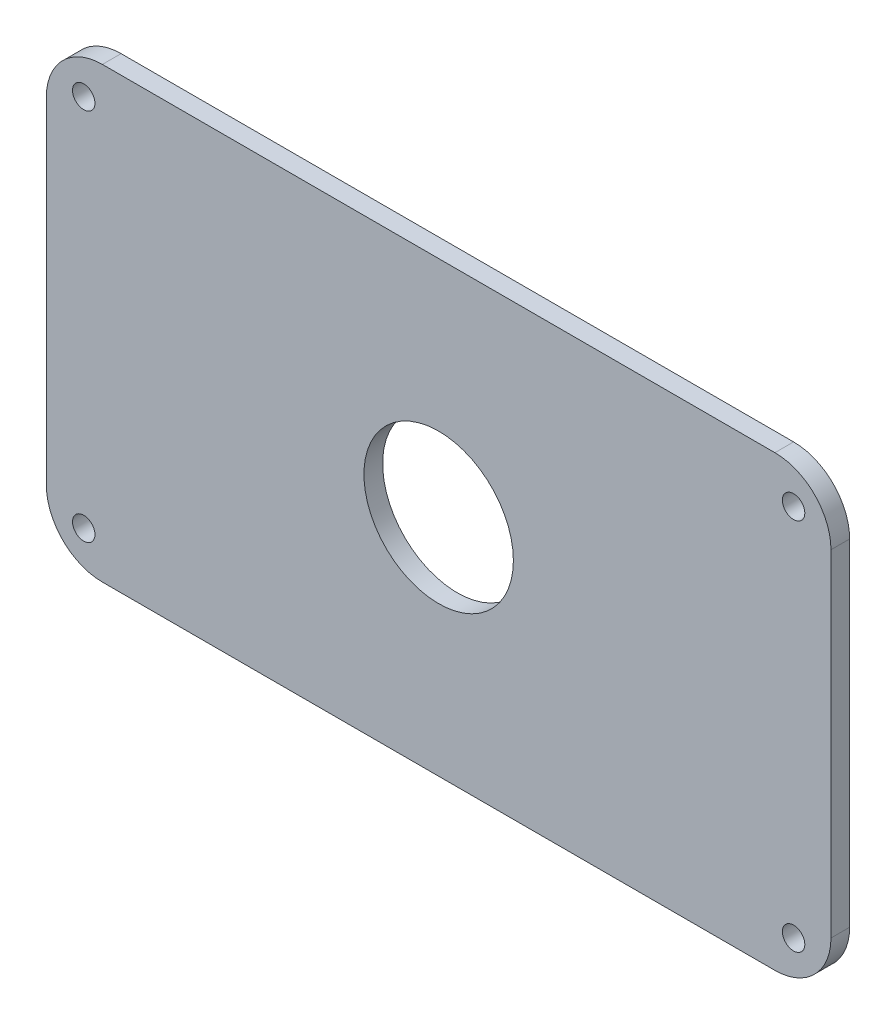
ISO-10303-21;
HEADER;
FILE_DESCRIPTION(('STEP AP214'),'2;1');
FILE_NAME('part.step','',(''),(''),'','','');
FILE_SCHEMA(('AUTOMOTIVE_DESIGN { 1 0 10303 214 1 1 1 1 }'));
ENDSEC;
DATA;
#1=APPLICATION_CONTEXT('core data for automotive mechanical design processes');
#2=APPLICATION_PROTOCOL_DEFINITION('international standard','automotive_design',2000,#1);
#3=PRODUCT_CONTEXT('',#1,'mechanical');
#4=PRODUCT('Part','Part','',(#3));
#5=PRODUCT_RELATED_PRODUCT_CATEGORY('part','',(#4));
#6=PRODUCT_DEFINITION_FORMATION('','',#4);
#7=PRODUCT_DEFINITION_CONTEXT('part definition',#1,'design');
#8=PRODUCT_DEFINITION('design','',#6,#7);
#9=PRODUCT_DEFINITION_SHAPE('','',#8);
#10=(LENGTH_UNIT() NAMED_UNIT(*) SI_UNIT(.MILLI.,.METRE.));
#11=(NAMED_UNIT(*) PLANE_ANGLE_UNIT() SI_UNIT($,.RADIAN.));
#12=(NAMED_UNIT(*) SI_UNIT($,.STERADIAN.) SOLID_ANGLE_UNIT());
#13=UNCERTAINTY_MEASURE_WITH_UNIT(LENGTH_MEASURE(1.E-05),#10,'distance_accuracy_value','');
#14=(GEOMETRIC_REPRESENTATION_CONTEXT(3) GLOBAL_UNCERTAINTY_ASSIGNED_CONTEXT((#13)) GLOBAL_UNIT_ASSIGNED_CONTEXT((#10,
#11,#12)) REPRESENTATION_CONTEXT('',''));
#15=CARTESIAN_POINT('',(0.,0.,0.));
#16=DIRECTION('',(0.,0.,1.));
#17=DIRECTION('',(1.,0.,0.));
#18=AXIS2_PLACEMENT_3D('',#15,#16,#17);
#19=CARTESIAN_POINT('',(15.,-45.,5.));
#20=DIRECTION('',(0.,0.,-1.));
#21=DIRECTION('',(-1.,0.,0.));
#22=AXIS2_PLACEMENT_3D('',#19,#20,#21);
#23=CYLINDRICAL_SURFACE('',#22,15.);
#24=CARTESIAN_POINT('',(15.,-45.,0.));
#25=DIRECTION('',(0.,0.,1.));
#26=DIRECTION('',(1.,0.,0.));
#27=AXIS2_PLACEMENT_3D('',#24,#25,#26);
#28=CIRCLE('',#27,15.);
#29=CARTESIAN_POINT('',(0.,-45.,0.));
#30=VERTEX_POINT('',#29);
#31=CARTESIAN_POINT('',(15.,-60.,0.));
#32=VERTEX_POINT('',#31);
#33=EDGE_CURVE('E133',#30,#32,#28,.T.);
#34=ORIENTED_EDGE('',*,*,#33,.T.);
#35=DIRECTION('',(0.,0.,-1.));
#36=VECTOR('',#35,1.);
#37=CARTESIAN_POINT('',(15.,-60.,5.));
#38=LINE('',#37,#36);
#39=CARTESIAN_POINT('',(15.,-60.,5.));
#40=VERTEX_POINT('',#39);
#41=EDGE_CURVE('E11',#40,#32,#38,.T.);
#42=ORIENTED_EDGE('',*,*,#41,.F.);
#43=CARTESIAN_POINT('',(15.,-45.,5.));
#44=DIRECTION('',(0.,0.,1.));
#45=DIRECTION('',(1.,0.,0.));
#46=AXIS2_PLACEMENT_3D('',#43,#44,#45);
#47=CIRCLE('',#46,15.);
#48=CARTESIAN_POINT('',(0.,-45.,5.));
#49=VERTEX_POINT('',#48);
#50=EDGE_CURVE('E148',#49,#40,#47,.T.);
#51=ORIENTED_EDGE('',*,*,#50,.F.);
#52=DIRECTION('',(0.,0.,-1.));
#53=VECTOR('',#52,1.);
#54=CARTESIAN_POINT('',(0.,-45.,5.));
#55=LINE('',#54,#53);
#56=EDGE_CURVE('E129',#49,#30,#55,.T.);
#57=ORIENTED_EDGE('',*,*,#56,.T.);
#58=EDGE_LOOP('',(#34,#42,#51,#57));
#59=FACE_BOUND('',#58,.T.);
#60=ADVANCED_FACE('F37',(#59),#23,.T.);
#61=CARTESIAN_POINT('',(15.,-60.,5.));
#62=DIRECTION('',(0.,1.,0.));
#63=DIRECTION('',(0.,0.,1.));
#64=AXIS2_PLACEMENT_3D('',#61,#62,#63);
#65=PLANE('',#64);
#66=DIRECTION('',(1.,0.,0.));
#67=VECTOR('',#66,1.);
#68=CARTESIAN_POINT('',(15.,-60.,0.));
#69=LINE('',#68,#67);
#70=CARTESIAN_POINT('',(195.,-60.,0.));
#71=VERTEX_POINT('',#70);
#72=EDGE_CURVE('E136',#32,#71,#69,.T.);
#73=ORIENTED_EDGE('',*,*,#72,.T.);
#74=DIRECTION('',(0.,0.,-1.));
#75=VECTOR('',#74,1.);
#76=CARTESIAN_POINT('',(195.,-60.,5.));
#77=LINE('',#76,#75);
#78=CARTESIAN_POINT('',(195.,-60.,5.));
#79=VERTEX_POINT('',#78);
#80=EDGE_CURVE('E45',#79,#71,#77,.T.);
#81=ORIENTED_EDGE('',*,*,#80,.F.);
#82=DIRECTION('',(1.,0.,0.));
#83=VECTOR('',#82,1.);
#84=CARTESIAN_POINT('',(15.,-60.,5.));
#85=LINE('',#84,#83);
#86=EDGE_CURVE('E96',#40,#79,#85,.T.);
#87=ORIENTED_EDGE('',*,*,#86,.F.);
#88=ORIENTED_EDGE('',*,*,#41,.T.);
#89=EDGE_LOOP('',(#73,#81,#87,#88));
#90=FACE_BOUND('',#89,.T.);
#91=ADVANCED_FACE('F247',(#90),#65,.F.);
#92=CARTESIAN_POINT('',(195.,-45.,5.));
#93=DIRECTION('',(0.,0.,-1.));
#94=DIRECTION('',(-1.,0.,0.));
#95=AXIS2_PLACEMENT_3D('',#92,#93,#94);
#96=CYLINDRICAL_SURFACE('',#95,15.);
#97=CARTESIAN_POINT('',(195.,-45.,0.));
#98=DIRECTION('',(0.,0.,1.));
#99=DIRECTION('',(-1.,0.,0.));
#100=AXIS2_PLACEMENT_3D('',#97,#98,#99);
#101=CIRCLE('',#100,15.);
#102=CARTESIAN_POINT('',(210.,-45.,0.));
#103=VERTEX_POINT('',#102);
#104=EDGE_CURVE('E139',#71,#103,#101,.T.);
#105=ORIENTED_EDGE('',*,*,#104,.T.);
#106=DIRECTION('',(0.,0.,-1.));
#107=VECTOR('',#106,1.);
#108=CARTESIAN_POINT('',(210.,-45.,5.));
#109=LINE('',#108,#107);
#110=CARTESIAN_POINT('',(210.,-45.,5.));
#111=VERTEX_POINT('',#110);
#112=EDGE_CURVE('E155',#111,#103,#109,.T.);
#113=ORIENTED_EDGE('',*,*,#112,.F.);
#114=CARTESIAN_POINT('',(195.,-45.,5.));
#115=DIRECTION('',(0.,0.,1.));
#116=DIRECTION('',(-1.,0.,0.));
#117=AXIS2_PLACEMENT_3D('',#114,#115,#116);
#118=CIRCLE('',#117,15.);
#119=EDGE_CURVE('E163',#79,#111,#118,.T.);
#120=ORIENTED_EDGE('',*,*,#119,.F.);
#121=ORIENTED_EDGE('',*,*,#80,.T.);
#122=EDGE_LOOP('',(#105,#113,#120,#121));
#123=FACE_BOUND('',#122,.T.);
#124=ADVANCED_FACE('F161',(#123),#96,.T.);
#125=CARTESIAN_POINT('',(210.,45.,5.));
#126=DIRECTION('',(-1.,0.,0.));
#127=DIRECTION('',(0.,0.,1.));
#128=AXIS2_PLACEMENT_3D('',#125,#126,#127);
#129=PLANE('',#128);
#130=DIRECTION('',(0.,1.,0.));
#131=VECTOR('',#130,1.);
#132=CARTESIAN_POINT('',(210.,45.,0.));
#133=LINE('',#132,#131);
#134=CARTESIAN_POINT('',(210.,45.,0.));
#135=VERTEX_POINT('',#134);
#136=EDGE_CURVE('E141',#103,#135,#133,.T.);
#137=ORIENTED_EDGE('',*,*,#136,.T.);
#138=DIRECTION('',(0.,0.,-1.));
#139=VECTOR('',#138,1.);
#140=CARTESIAN_POINT('',(210.,45.,5.));
#141=LINE('',#140,#139);
#142=CARTESIAN_POINT('',(210.,45.,5.));
#143=VERTEX_POINT('',#142);
#144=EDGE_CURVE('E152',#143,#135,#141,.T.);
#145=ORIENTED_EDGE('',*,*,#144,.F.);
#146=DIRECTION('',(0.,1.,0.));
#147=VECTOR('',#146,1.);
#148=CARTESIAN_POINT('',(210.,45.,5.));
#149=LINE('',#148,#147);
#150=EDGE_CURVE('E175',#111,#143,#149,.T.);
#151=ORIENTED_EDGE('',*,*,#150,.F.);
#152=ORIENTED_EDGE('',*,*,#112,.T.);
#153=EDGE_LOOP('',(#137,#145,#151,#152));
#154=FACE_BOUND('',#153,.T.);
#155=ADVANCED_FACE('F171',(#154),#129,.F.);
#156=CARTESIAN_POINT('',(195.,45.,5.));
#157=DIRECTION('',(0.,0.,-1.));
#158=DIRECTION('',(-1.,0.,0.));
#159=AXIS2_PLACEMENT_3D('',#156,#157,#158);
#160=CYLINDRICAL_SURFACE('',#159,15.);
#161=CARTESIAN_POINT('',(195.,45.,0.));
#162=DIRECTION('',(0.,0.,1.));
#163=DIRECTION('',(-1.,0.,0.));
#164=AXIS2_PLACEMENT_3D('',#161,#162,#163);
#165=CIRCLE('',#164,15.);
#166=CARTESIAN_POINT('',(195.,60.,0.));
#167=VERTEX_POINT('',#166);
#168=EDGE_CURVE('E143',#135,#167,#165,.T.);
#169=ORIENTED_EDGE('',*,*,#168,.T.);
#170=DIRECTION('',(0.,0.,-1.));
#171=VECTOR('',#170,1.);
#172=CARTESIAN_POINT('',(195.,60.,5.));
#173=LINE('',#172,#171);
#174=CARTESIAN_POINT('',(195.,60.,5.));
#175=VERTEX_POINT('',#174);
#176=EDGE_CURVE('E124',#175,#167,#173,.T.);
#177=ORIENTED_EDGE('',*,*,#176,.F.);
#178=CARTESIAN_POINT('',(195.,45.,5.));
#179=DIRECTION('',(0.,0.,1.));
#180=DIRECTION('',(-1.,0.,0.));
#181=AXIS2_PLACEMENT_3D('',#178,#179,#180);
#182=CIRCLE('',#181,15.);
#183=EDGE_CURVE('E115',#143,#175,#182,.T.);
#184=ORIENTED_EDGE('',*,*,#183,.F.);
#185=ORIENTED_EDGE('',*,*,#144,.T.);
#186=EDGE_LOOP('',(#169,#177,#184,#185));
#187=FACE_BOUND('',#186,.T.);
#188=ADVANCED_FACE('F174',(#187),#160,.T.);
#189=CARTESIAN_POINT('',(15.,60.,5.));
#190=DIRECTION('',(0.,-1.,0.));
#191=DIRECTION('',(0.,0.,-1.));
#192=AXIS2_PLACEMENT_3D('',#189,#190,#191);
#193=PLANE('',#192);
#194=DIRECTION('',(-1.,0.,0.));
#195=VECTOR('',#194,1.);
#196=CARTESIAN_POINT('',(15.,60.,0.));
#197=LINE('',#196,#195);
#198=CARTESIAN_POINT('',(15.,60.,0.));
#199=VERTEX_POINT('',#198);
#200=EDGE_CURVE('E123',#167,#199,#197,.T.);
#201=ORIENTED_EDGE('',*,*,#200,.T.);
#202=DIRECTION('',(0.,0.,-1.));
#203=VECTOR('',#202,1.);
#204=CARTESIAN_POINT('',(15.,60.,5.));
#205=LINE('',#204,#203);
#206=CARTESIAN_POINT('',(15.,60.,5.));
#207=VERTEX_POINT('',#206);
#208=EDGE_CURVE('E120',#207,#199,#205,.T.);
#209=ORIENTED_EDGE('',*,*,#208,.F.);
#210=DIRECTION('',(-1.,0.,0.));
#211=VECTOR('',#210,1.);
#212=CARTESIAN_POINT('',(15.,60.,5.));
#213=LINE('',#212,#211);
#214=EDGE_CURVE('E109',#175,#207,#213,.T.);
#215=ORIENTED_EDGE('',*,*,#214,.F.);
#216=ORIENTED_EDGE('',*,*,#176,.T.);
#217=EDGE_LOOP('',(#201,#209,#215,#216));
#218=FACE_BOUND('',#217,.T.);
#219=ADVANCED_FACE('F121',(#218),#193,.F.);
#220=CARTESIAN_POINT('',(15.,45.,5.));
#221=DIRECTION('',(0.,0.,-1.));
#222=DIRECTION('',(-1.,0.,0.));
#223=AXIS2_PLACEMENT_3D('',#220,#221,#222);
#224=CYLINDRICAL_SURFACE('',#223,15.);
#225=CARTESIAN_POINT('',(15.,45.,0.));
#226=DIRECTION('',(0.,0.,1.));
#227=DIRECTION('',(1.,0.,0.));
#228=AXIS2_PLACEMENT_3D('',#225,#226,#227);
#229=CIRCLE('',#228,15.);
#230=CARTESIAN_POINT('',(0.,45.,0.));
#231=VERTEX_POINT('',#230);
#232=EDGE_CURVE('E82',#199,#231,#229,.T.);
#233=ORIENTED_EDGE('',*,*,#232,.T.);
#234=DIRECTION('',(0.,0.,-1.));
#235=VECTOR('',#234,1.);
#236=CARTESIAN_POINT('',(0.,45.,5.));
#237=LINE('',#236,#235);
#238=CARTESIAN_POINT('',(0.,45.,5.));
#239=VERTEX_POINT('',#238);
#240=EDGE_CURVE('E125',#239,#231,#237,.T.);
#241=ORIENTED_EDGE('',*,*,#240,.F.);
#242=CARTESIAN_POINT('',(15.,45.,5.));
#243=DIRECTION('',(0.,0.,1.));
#244=DIRECTION('',(1.,0.,0.));
#245=AXIS2_PLACEMENT_3D('',#242,#243,#244);
#246=CIRCLE('',#245,15.);
#247=EDGE_CURVE('E113',#207,#239,#246,.T.);
#248=ORIENTED_EDGE('',*,*,#247,.F.);
#249=ORIENTED_EDGE('',*,*,#208,.T.);
#250=EDGE_LOOP('',(#233,#241,#248,#249));
#251=FACE_BOUND('',#250,.T.);
#252=ADVANCED_FACE('F127',(#251),#224,.T.);
#253=CARTESIAN_POINT('',(0.,45.,5.));
#254=DIRECTION('',(1.,0.,0.));
#255=DIRECTION('',(0.,0.,-1.));
#256=AXIS2_PLACEMENT_3D('',#253,#254,#255);
#257=PLANE('',#256);
#258=DIRECTION('',(0.,-1.,0.));
#259=VECTOR('',#258,1.);
#260=CARTESIAN_POINT('',(0.,45.,0.));
#261=LINE('',#260,#259);
#262=EDGE_CURVE('E88',#231,#30,#261,.T.);
#263=ORIENTED_EDGE('',*,*,#262,.T.);
#264=ORIENTED_EDGE('',*,*,#56,.F.);
#265=DIRECTION('',(0.,-1.,0.));
#266=VECTOR('',#265,1.);
#267=CARTESIAN_POINT('',(0.,45.,5.));
#268=LINE('',#267,#266);
#269=EDGE_CURVE('E53',#239,#49,#268,.T.);
#270=ORIENTED_EDGE('',*,*,#269,.F.);
#271=ORIENTED_EDGE('',*,*,#240,.T.);
#272=EDGE_LOOP('',(#263,#264,#270,#271));
#273=FACE_BOUND('',#272,.T.);
#274=ADVANCED_FACE('F222',(#273),#257,.F.);
#275=CARTESIAN_POINT('',(15.,-45.,5.));
#276=DIRECTION('',(0.,0.,1.));
#277=DIRECTION('',(1.,0.,0.));
#278=AXIS2_PLACEMENT_3D('',#275,#276,#277);
#279=PLANE('',#278);
#280=CARTESIAN_POINT('',(200.,50.,5.));
#281=DIRECTION('',(0.,0.,1.));
#282=DIRECTION('',(-1.,0.,0.));
#283=AXIS2_PLACEMENT_3D('',#280,#281,#282);
#284=CIRCLE('',#283,2.99999999999999);
#285=CARTESIAN_POINT('',(197.,50.,5.));
#286=VERTEX_POINT('',#285);
#287=EDGE_CURVE('E205',#286,#286,#284,.T.);
#288=ORIENTED_EDGE('',*,*,#287,.F.);
#289=EDGE_LOOP('',(#288));
#290=FACE_BOUND('',#289,.T.);
#291=CARTESIAN_POINT('',(200.,-50.,5.));
#292=DIRECTION('',(0.,0.,1.));
#293=DIRECTION('',(1.,0.,0.));
#294=AXIS2_PLACEMENT_3D('',#291,#292,#293);
#295=CIRCLE('',#294,2.99999999999999);
#296=CARTESIAN_POINT('',(203.,-50.,5.));
#297=VERTEX_POINT('',#296);
#298=EDGE_CURVE('E199',#297,#297,#295,.T.);
#299=ORIENTED_EDGE('',*,*,#298,.F.);
#300=EDGE_LOOP('',(#299));
#301=FACE_BOUND('',#300,.T.);
#302=CARTESIAN_POINT('',(10.,-50.,5.));
#303=DIRECTION('',(0.,0.,1.));
#304=DIRECTION('',(-1.,0.,0.));
#305=AXIS2_PLACEMENT_3D('',#302,#303,#304);
#306=CIRCLE('',#305,3.);
#307=CARTESIAN_POINT('',(7.00000000000001,-50.,5.));
#308=VERTEX_POINT('',#307);
#309=EDGE_CURVE('E193',#308,#308,#306,.T.);
#310=ORIENTED_EDGE('',*,*,#309,.F.);
#311=EDGE_LOOP('',(#310));
#312=FACE_BOUND('',#311,.T.);
#313=CARTESIAN_POINT('',(10.,50.,5.));
#314=DIRECTION('',(0.,0.,1.));
#315=DIRECTION('',(1.,0.,0.));
#316=AXIS2_PLACEMENT_3D('',#313,#314,#315);
#317=CIRCLE('',#316,3.);
#318=CARTESIAN_POINT('',(13.,50.,5.));
#319=VERTEX_POINT('',#318);
#320=EDGE_CURVE('E187',#319,#319,#317,.T.);
#321=ORIENTED_EDGE('',*,*,#320,.F.);
#322=EDGE_LOOP('',(#321));
#323=FACE_BOUND('',#322,.T.);
#324=CARTESIAN_POINT('',(105.,0.,5.));
#325=DIRECTION('',(0.,0.,1.));
#326=DIRECTION('',(1.,0.,0.));
#327=AXIS2_PLACEMENT_3D('',#324,#325,#326);
#328=CIRCLE('',#327,20.);
#329=CARTESIAN_POINT('',(125.,0.,5.));
#330=VERTEX_POINT('',#329);
#331=EDGE_CURVE('E181',#330,#330,#328,.T.);
#332=ORIENTED_EDGE('',*,*,#331,.F.);
#333=EDGE_LOOP('',(#332));
#334=FACE_BOUND('',#333,.T.);
#335=ORIENTED_EDGE('',*,*,#50,.T.);
#336=ORIENTED_EDGE('',*,*,#86,.T.);
#337=ORIENTED_EDGE('',*,*,#119,.T.);
#338=ORIENTED_EDGE('',*,*,#150,.T.);
#339=ORIENTED_EDGE('',*,*,#183,.T.);
#340=ORIENTED_EDGE('',*,*,#214,.T.);
#341=ORIENTED_EDGE('',*,*,#247,.T.);
#342=ORIENTED_EDGE('',*,*,#269,.T.);
#343=EDGE_LOOP('',(#335,#336,#337,#338,#339,#340,#341,#342));
#344=FACE_BOUND('',#343,.T.);
#345=ADVANCED_FACE('F111',(#290,#301,#312,#323,#334,#344),#279,.T.);
#346=CARTESIAN_POINT('',(15.,-45.,0.));
#347=DIRECTION('',(0.,0.,1.));
#348=DIRECTION('',(1.,0.,0.));
#349=AXIS2_PLACEMENT_3D('',#346,#347,#348);
#350=PLANE('',#349);
#351=CARTESIAN_POINT('',(200.,50.,0.));
#352=DIRECTION('',(0.,0.,1.));
#353=DIRECTION('',(-1.,0.,0.));
#354=AXIS2_PLACEMENT_3D('',#351,#352,#353);
#355=CIRCLE('',#354,2.99999999999999);
#356=CARTESIAN_POINT('',(197.,50.,0.));
#357=VERTEX_POINT('',#356);
#358=EDGE_CURVE('E202',#357,#357,#355,.T.);
#359=ORIENTED_EDGE('',*,*,#358,.T.);
#360=EDGE_LOOP('',(#359));
#361=FACE_BOUND('',#360,.T.);
#362=CARTESIAN_POINT('',(200.,-50.,0.));
#363=DIRECTION('',(0.,0.,1.));
#364=DIRECTION('',(1.,0.,0.));
#365=AXIS2_PLACEMENT_3D('',#362,#363,#364);
#366=CIRCLE('',#365,2.99999999999999);
#367=CARTESIAN_POINT('',(203.,-50.,0.));
#368=VERTEX_POINT('',#367);
#369=EDGE_CURVE('E196',#368,#368,#366,.T.);
#370=ORIENTED_EDGE('',*,*,#369,.T.);
#371=EDGE_LOOP('',(#370));
#372=FACE_BOUND('',#371,.T.);
#373=CARTESIAN_POINT('',(10.,-50.,0.));
#374=DIRECTION('',(0.,0.,1.));
#375=DIRECTION('',(-1.,0.,0.));
#376=AXIS2_PLACEMENT_3D('',#373,#374,#375);
#377=CIRCLE('',#376,3.);
#378=CARTESIAN_POINT('',(7.00000000000001,-50.,0.));
#379=VERTEX_POINT('',#378);
#380=EDGE_CURVE('E190',#379,#379,#377,.T.);
#381=ORIENTED_EDGE('',*,*,#380,.T.);
#382=EDGE_LOOP('',(#381));
#383=FACE_BOUND('',#382,.T.);
#384=CARTESIAN_POINT('',(10.,50.,0.));
#385=DIRECTION('',(0.,0.,1.));
#386=DIRECTION('',(1.,0.,0.));
#387=AXIS2_PLACEMENT_3D('',#384,#385,#386);
#388=CIRCLE('',#387,3.);
#389=CARTESIAN_POINT('',(13.,50.,0.));
#390=VERTEX_POINT('',#389);
#391=EDGE_CURVE('E184',#390,#390,#388,.T.);
#392=ORIENTED_EDGE('',*,*,#391,.T.);
#393=EDGE_LOOP('',(#392));
#394=FACE_BOUND('',#393,.T.);
#395=CARTESIAN_POINT('',(105.,0.,0.));
#396=DIRECTION('',(0.,0.,1.));
#397=DIRECTION('',(1.,0.,0.));
#398=AXIS2_PLACEMENT_3D('',#395,#396,#397);
#399=CIRCLE('',#398,20.);
#400=CARTESIAN_POINT('',(125.,0.,0.));
#401=VERTEX_POINT('',#400);
#402=EDGE_CURVE('E137',#401,#401,#399,.T.);
#403=ORIENTED_EDGE('',*,*,#402,.T.);
#404=EDGE_LOOP('',(#403));
#405=FACE_BOUND('',#404,.T.);
#406=ORIENTED_EDGE('',*,*,#33,.F.);
#407=ORIENTED_EDGE('',*,*,#262,.F.);
#408=ORIENTED_EDGE('',*,*,#232,.F.);
#409=ORIENTED_EDGE('',*,*,#200,.F.);
#410=ORIENTED_EDGE('',*,*,#168,.F.);
#411=ORIENTED_EDGE('',*,*,#136,.F.);
#412=ORIENTED_EDGE('',*,*,#104,.F.);
#413=ORIENTED_EDGE('',*,*,#72,.F.);
#414=EDGE_LOOP('',(#406,#407,#408,#409,#410,#411,#412,#413));
#415=FACE_BOUND('',#414,.T.);
#416=ADVANCED_FACE('F167',(#361,#372,#383,#394,#405,#415),#350,.F.);
#417=CARTESIAN_POINT('',(105.,0.,0.));
#418=DIRECTION('',(0.,0.,1.));
#419=DIRECTION('',(1.,0.,0.));
#420=AXIS2_PLACEMENT_3D('',#417,#418,#419);
#421=CYLINDRICAL_SURFACE('',#420,20.);
#422=ORIENTED_EDGE('',*,*,#402,.F.);
#423=EDGE_LOOP('',(#422));
#424=FACE_BOUND('',#423,.T.);
#425=ORIENTED_EDGE('',*,*,#331,.T.);
#426=EDGE_LOOP('',(#425));
#427=FACE_BOUND('',#426,.T.);
#428=ADVANCED_FACE('F232',(#424,#427),#421,.F.);
#429=CARTESIAN_POINT('',(10.,50.,0.));
#430=DIRECTION('',(0.,0.,1.));
#431=DIRECTION('',(1.,0.,0.));
#432=AXIS2_PLACEMENT_3D('',#429,#430,#431);
#433=CYLINDRICAL_SURFACE('',#432,3.);
#434=ORIENTED_EDGE('',*,*,#391,.F.);
#435=EDGE_LOOP('',(#434));
#436=FACE_BOUND('',#435,.T.);
#437=ORIENTED_EDGE('',*,*,#320,.T.);
#438=EDGE_LOOP('',(#437));
#439=FACE_BOUND('',#438,.T.);
#440=ADVANCED_FACE('F234',(#436,#439),#433,.F.);
#441=CARTESIAN_POINT('',(10.,-50.,0.));
#442=DIRECTION('',(0.,0.,1.));
#443=DIRECTION('',(1.,0.,0.));
#444=AXIS2_PLACEMENT_3D('',#441,#442,#443);
#445=CYLINDRICAL_SURFACE('',#444,3.);
#446=ORIENTED_EDGE('',*,*,#380,.F.);
#447=EDGE_LOOP('',(#446));
#448=FACE_BOUND('',#447,.T.);
#449=ORIENTED_EDGE('',*,*,#309,.T.);
#450=EDGE_LOOP('',(#449));
#451=FACE_BOUND('',#450,.T.);
#452=ADVANCED_FACE('F241',(#448,#451),#445,.F.);
#453=CARTESIAN_POINT('',(200.,-50.,0.));
#454=DIRECTION('',(0.,0.,1.));
#455=DIRECTION('',(1.,0.,0.));
#456=AXIS2_PLACEMENT_3D('',#453,#454,#455);
#457=CYLINDRICAL_SURFACE('',#456,2.99999999999999);
#458=ORIENTED_EDGE('',*,*,#369,.F.);
#459=EDGE_LOOP('',(#458));
#460=FACE_BOUND('',#459,.T.);
#461=ORIENTED_EDGE('',*,*,#298,.T.);
#462=EDGE_LOOP('',(#461));
#463=FACE_BOUND('',#462,.T.);
#464=ADVANCED_FACE('F216',(#460,#463),#457,.F.);
#465=CARTESIAN_POINT('',(200.,50.,0.));
#466=DIRECTION('',(0.,0.,1.));
#467=DIRECTION('',(1.,0.,0.));
#468=AXIS2_PLACEMENT_3D('',#465,#466,#467);
#469=CYLINDRICAL_SURFACE('',#468,2.99999999999999);
#470=ORIENTED_EDGE('',*,*,#358,.F.);
#471=EDGE_LOOP('',(#470));
#472=FACE_BOUND('',#471,.T.);
#473=ORIENTED_EDGE('',*,*,#287,.T.);
#474=EDGE_LOOP('',(#473));
#475=FACE_BOUND('',#474,.T.);
#476=ADVANCED_FACE('F213',(#472,#475),#469,.F.);
#477=CLOSED_SHELL('',(#60,#91,#124,#155,#188,#219,#252,#274,#345,#416,#428,#440,#452,#464,#476));
#478=MANIFOLD_SOLID_BREP('B2',#477);
#479=ADVANCED_BREP_SHAPE_REPRESENTATION('',(#18,#478),#14);
#480=SHAPE_DEFINITION_REPRESENTATION(#9,#479);
ENDSEC;
END-ISO-10303-21;
